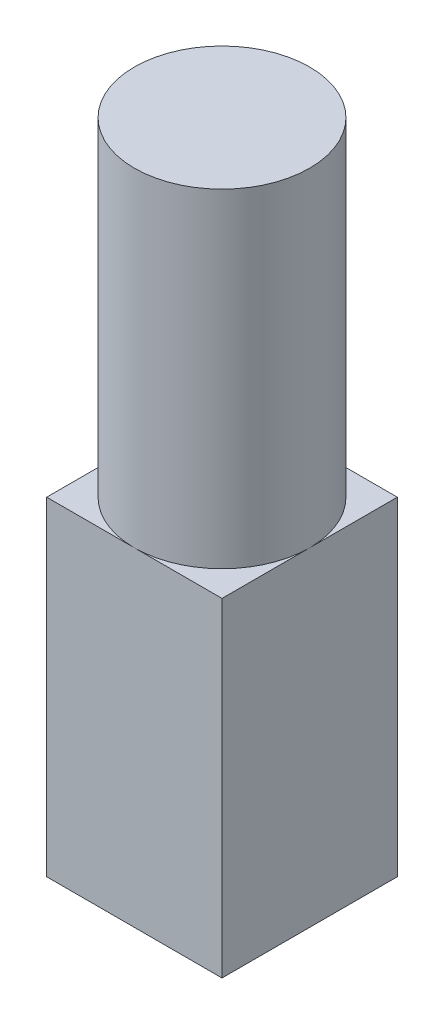
ISO-10303-21;
HEADER;
FILE_DESCRIPTION(('STEP AP214'),'2;1');
FILE_NAME('part.step','',(''),(''),'','','');
FILE_SCHEMA(('AUTOMOTIVE_DESIGN { 1 0 10303 214 1 1 1 1 }'));
ENDSEC;
DATA;
#1=APPLICATION_CONTEXT('core data for automotive mechanical design processes');
#2=APPLICATION_PROTOCOL_DEFINITION('international standard','automotive_design',2000,#1);
#3=PRODUCT_CONTEXT('',#1,'mechanical');
#4=PRODUCT('Part','Part','',(#3));
#5=PRODUCT_RELATED_PRODUCT_CATEGORY('part','',(#4));
#6=PRODUCT_DEFINITION_FORMATION('','',#4);
#7=PRODUCT_DEFINITION_CONTEXT('part definition',#1,'design');
#8=PRODUCT_DEFINITION('design','',#6,#7);
#9=PRODUCT_DEFINITION_SHAPE('','',#8);
#10=(LENGTH_UNIT() NAMED_UNIT(*) SI_UNIT(.MILLI.,.METRE.));
#11=(NAMED_UNIT(*) PLANE_ANGLE_UNIT() SI_UNIT($,.RADIAN.));
#12=(NAMED_UNIT(*) SI_UNIT($,.STERADIAN.) SOLID_ANGLE_UNIT());
#13=UNCERTAINTY_MEASURE_WITH_UNIT(LENGTH_MEASURE(1.E-05),#10,'distance_accuracy_value','');
#14=(GEOMETRIC_REPRESENTATION_CONTEXT(3) GLOBAL_UNCERTAINTY_ASSIGNED_CONTEXT((#13)) GLOBAL_UNIT_ASSIGNED_CONTEXT((#10,
#11,#12)) REPRESENTATION_CONTEXT('',''));
#15=CARTESIAN_POINT('',(0.,0.,0.));
#16=DIRECTION('',(0.,0.,1.));
#17=DIRECTION('',(1.,0.,0.));
#18=AXIS2_PLACEMENT_3D('',#15,#16,#17);
#19=CARTESIAN_POINT('',(0.,3.,0.));
#20=DIRECTION('',(0.,1.,0.));
#21=DIRECTION('',(0.,0.,1.));
#22=AXIS2_PLACEMENT_3D('',#19,#20,#21);
#23=PLANE('',#22);
#24=CARTESIAN_POINT('',(-86.8409372332624,3.,12.4374332279407));
#25=DIRECTION('',(0.,1.,0.));
#26=DIRECTION('',(0.,0.,1.));
#27=AXIS2_PLACEMENT_3D('',#24,#25,#26);
#28=CIRCLE('',#27,0.80000000000001);
#29=CARTESIAN_POINT('',(-86.8409372332624,3.,13.2374332279407));
#30=VERTEX_POINT('',#29);
#31=CARTESIAN_POINT('',(-86.0409372332624,3.,12.4374332279407));
#32=VERTEX_POINT('',#31);
#33=EDGE_CURVE('E57',#30,#32,#28,.T.);
#34=ORIENTED_EDGE('',*,*,#33,.F.);
#35=DIRECTION('',(1.,0.,0.));
#36=VECTOR('',#35,1.);
#37=CARTESIAN_POINT('',(-87.6409372332624,3.,13.2374332279407));
#38=LINE('',#37,#36);
#39=CARTESIAN_POINT('',(-86.0409372332624,3.,13.2374332279407));
#40=VERTEX_POINT('',#39);
#41=EDGE_CURVE('E112',#30,#40,#38,.T.);
#42=ORIENTED_EDGE('',*,*,#41,.T.);
#43=DIRECTION('',(0.,0.,-1.));
#44=VECTOR('',#43,1.);
#45=CARTESIAN_POINT('',(-86.0409372332624,3.,11.6374332279407));
#46=LINE('',#45,#44);
#47=EDGE_CURVE('E125',#40,#32,#46,.T.);
#48=ORIENTED_EDGE('',*,*,#47,.T.);
#49=EDGE_LOOP('',(#34,#42,#48));
#50=FACE_BOUND('',#49,.T.);
#51=ADVANCED_FACE('F45',(#50),#23,.T.);
#52=CARTESIAN_POINT('',(-86.8409372332624,3.,11.6374332279407));
#53=VERTEX_POINT('',#52);
#54=EDGE_CURVE('E11',#32,#53,#28,.T.);
#55=ORIENTED_EDGE('',*,*,#54,.F.);
#56=CARTESIAN_POINT('',(-86.0409372332624,3.,11.6374332279407));
#57=VERTEX_POINT('',#56);
#58=EDGE_CURVE('E111',#32,#57,#46,.T.);
#59=ORIENTED_EDGE('',*,*,#58,.T.);
#60=DIRECTION('',(-1.,0.,0.));
#61=VECTOR('',#60,1.);
#62=CARTESIAN_POINT('',(-87.6409372332624,3.,11.6374332279407));
#63=LINE('',#62,#61);
#64=EDGE_CURVE('E140',#57,#53,#63,.T.);
#65=ORIENTED_EDGE('',*,*,#64,.T.);
#66=EDGE_LOOP('',(#55,#59,#65));
#67=FACE_BOUND('',#66,.T.);
#68=ADVANCED_FACE('F199',(#67),#23,.T.);
#69=CARTESIAN_POINT('',(-87.6409372332624,3.,12.4374332279407));
#70=VERTEX_POINT('',#69);
#71=EDGE_CURVE('E55',#53,#70,#28,.T.);
#72=ORIENTED_EDGE('',*,*,#71,.F.);
#73=CARTESIAN_POINT('',(-87.6409372332624,3.,11.6374332279407));
#74=VERTEX_POINT('',#73);
#75=EDGE_CURVE('E139',#53,#74,#63,.T.);
#76=ORIENTED_EDGE('',*,*,#75,.T.);
#77=DIRECTION('',(0.,0.,1.));
#78=VECTOR('',#77,1.);
#79=CARTESIAN_POINT('',(-87.6409372332624,3.,11.6374332279407));
#80=LINE('',#79,#78);
#81=EDGE_CURVE('E123',#74,#70,#80,.T.);
#82=ORIENTED_EDGE('',*,*,#81,.T.);
#83=EDGE_LOOP('',(#72,#76,#82));
#84=FACE_BOUND('',#83,.T.);
#85=ADVANCED_FACE('F178',(#84),#23,.T.);
#86=CARTESIAN_POINT('',(-87.6409372332624,3.,11.6374332279407));
#87=DIRECTION('',(1.,0.,0.));
#88=DIRECTION('',(0.,0.,-1.));
#89=AXIS2_PLACEMENT_3D('',#86,#87,#88);
#90=PLANE('',#89);
#91=DIRECTION('',(0.,0.,1.));
#92=VECTOR('',#91,1.);
#93=CARTESIAN_POINT('',(-87.6409372332624,0.,11.6374332279407));
#94=LINE('',#93,#92);
#95=CARTESIAN_POINT('',(-87.6409372332624,0.,11.6374332279407));
#96=VERTEX_POINT('',#95);
#97=CARTESIAN_POINT('',(-87.6409372332624,0.,13.2374332279407));
#98=VERTEX_POINT('',#97);
#99=EDGE_CURVE('E144',#96,#98,#94,.T.);
#100=ORIENTED_EDGE('',*,*,#99,.T.);
#101=DIRECTION('',(0.,-1.,0.));
#102=VECTOR('',#101,1.);
#103=CARTESIAN_POINT('',(-87.6409372332624,3.,13.2374332279407));
#104=LINE('',#103,#102);
#105=CARTESIAN_POINT('',(-87.6409372332624,3.,13.2374332279407));
#106=VERTEX_POINT('',#105);
#107=EDGE_CURVE('E49',#106,#98,#104,.T.);
#108=ORIENTED_EDGE('',*,*,#107,.F.);
#109=EDGE_CURVE('E106',#70,#106,#80,.T.);
#110=ORIENTED_EDGE('',*,*,#109,.F.);
#111=ORIENTED_EDGE('',*,*,#81,.F.);
#112=DIRECTION('',(0.,-1.,0.));
#113=VECTOR('',#112,1.);
#114=CARTESIAN_POINT('',(-87.6409372332624,3.,11.6374332279407));
#115=LINE('',#114,#113);
#116=EDGE_CURVE('E143',#74,#96,#115,.T.);
#117=ORIENTED_EDGE('',*,*,#116,.T.);
#118=EDGE_LOOP('',(#100,#108,#110,#111,#117));
#119=FACE_BOUND('',#118,.T.);
#120=ADVANCED_FACE('F47',(#119),#90,.F.);
#121=CARTESIAN_POINT('',(-87.6409372332624,3.,13.2374332279407));
#122=DIRECTION('',(0.,0.,-1.));
#123=DIRECTION('',(-1.,0.,0.));
#124=AXIS2_PLACEMENT_3D('',#121,#122,#123);
#125=PLANE('',#124);
#126=DIRECTION('',(1.,0.,0.));
#127=VECTOR('',#126,1.);
#128=CARTESIAN_POINT('',(-87.6409372332624,0.,13.2374332279407));
#129=LINE('',#128,#127);
#130=CARTESIAN_POINT('',(-86.0409372332624,0.,13.2374332279407));
#131=VERTEX_POINT('',#130);
#132=EDGE_CURVE('E148',#98,#131,#129,.T.);
#133=ORIENTED_EDGE('',*,*,#132,.T.);
#134=DIRECTION('',(0.,-1.,0.));
#135=VECTOR('',#134,1.);
#136=CARTESIAN_POINT('',(-86.0409372332624,3.,13.2374332279407));
#137=LINE('',#136,#135);
#138=EDGE_CURVE('E118',#40,#131,#137,.T.);
#139=ORIENTED_EDGE('',*,*,#138,.F.);
#140=ORIENTED_EDGE('',*,*,#41,.F.);
#141=EDGE_CURVE('E100',#106,#30,#38,.T.);
#142=ORIENTED_EDGE('',*,*,#141,.F.);
#143=ORIENTED_EDGE('',*,*,#107,.T.);
#144=EDGE_LOOP('',(#133,#139,#140,#142,#143));
#145=FACE_BOUND('',#144,.T.);
#146=ADVANCED_FACE('F116',(#145),#125,.F.);
#147=CARTESIAN_POINT('',(-86.0409372332624,3.,11.6374332279407));
#148=DIRECTION('',(-1.,0.,0.));
#149=DIRECTION('',(0.,0.,1.));
#150=AXIS2_PLACEMENT_3D('',#147,#148,#149);
#151=PLANE('',#150);
#152=DIRECTION('',(0.,0.,-1.));
#153=VECTOR('',#152,1.);
#154=CARTESIAN_POINT('',(-86.0409372332624,0.,11.6374332279407));
#155=LINE('',#154,#153);
#156=CARTESIAN_POINT('',(-86.0409372332624,0.,11.6374332279407));
#157=VERTEX_POINT('',#156);
#158=EDGE_CURVE('E151',#131,#157,#155,.T.);
#159=ORIENTED_EDGE('',*,*,#158,.T.);
#160=DIRECTION('',(0.,-1.,0.));
#161=VECTOR('',#160,1.);
#162=CARTESIAN_POINT('',(-86.0409372332624,3.,11.6374332279407));
#163=LINE('',#162,#161);
#164=EDGE_CURVE('E160',#57,#157,#163,.T.);
#165=ORIENTED_EDGE('',*,*,#164,.F.);
#166=ORIENTED_EDGE('',*,*,#58,.F.);
#167=ORIENTED_EDGE('',*,*,#47,.F.);
#168=ORIENTED_EDGE('',*,*,#138,.T.);
#169=EDGE_LOOP('',(#159,#165,#166,#167,#168));
#170=FACE_BOUND('',#169,.T.);
#171=ADVANCED_FACE('F166',(#170),#151,.F.);
#172=CARTESIAN_POINT('',(-87.6409372332624,3.,11.6374332279407));
#173=DIRECTION('',(0.,0.,1.));
#174=DIRECTION('',(1.,0.,0.));
#175=AXIS2_PLACEMENT_3D('',#172,#173,#174);
#176=PLANE('',#175);
#177=DIRECTION('',(-1.,0.,0.));
#178=VECTOR('',#177,1.);
#179=CARTESIAN_POINT('',(-87.6409372332624,0.,11.6374332279407));
#180=LINE('',#179,#178);
#181=EDGE_CURVE('E154',#157,#96,#180,.T.);
#182=ORIENTED_EDGE('',*,*,#181,.T.);
#183=ORIENTED_EDGE('',*,*,#116,.F.);
#184=ORIENTED_EDGE('',*,*,#75,.F.);
#185=ORIENTED_EDGE('',*,*,#64,.F.);
#186=ORIENTED_EDGE('',*,*,#164,.T.);
#187=EDGE_LOOP('',(#182,#183,#184,#185,#186));
#188=FACE_BOUND('',#187,.T.);
#189=ADVANCED_FACE('F174',(#188),#176,.F.);
#190=EDGE_CURVE('E104',#70,#30,#28,.T.);
#191=ORIENTED_EDGE('',*,*,#190,.F.);
#192=ORIENTED_EDGE('',*,*,#109,.T.);
#193=ORIENTED_EDGE('',*,*,#141,.T.);
#194=EDGE_LOOP('',(#191,#192,#193));
#195=FACE_BOUND('',#194,.T.);
#196=ADVANCED_FACE('F102',(#195),#23,.T.);
#197=CARTESIAN_POINT('',(0.,0.,0.));
#198=DIRECTION('',(0.,1.,0.));
#199=DIRECTION('',(0.,0.,1.));
#200=AXIS2_PLACEMENT_3D('',#197,#198,#199);
#201=PLANE('',#200);
#202=ORIENTED_EDGE('',*,*,#99,.F.);
#203=ORIENTED_EDGE('',*,*,#181,.F.);
#204=ORIENTED_EDGE('',*,*,#158,.F.);
#205=ORIENTED_EDGE('',*,*,#132,.F.);
#206=EDGE_LOOP('',(#202,#203,#204,#205));
#207=FACE_BOUND('',#206,.T.);
#208=ADVANCED_FACE('F171',(#207),#201,.F.);
#209=CARTESIAN_POINT('',(-86.8409372332624,6.,12.4374332279407));
#210=DIRECTION('',(0.,-1.,0.));
#211=DIRECTION('',(0.,0.,-1.));
#212=AXIS2_PLACEMENT_3D('',#209,#210,#211);
#213=CYLINDRICAL_SURFACE('',#212,0.80000000000001);
#214=CARTESIAN_POINT('',(-86.8409372332624,6.,12.4374332279407));
#215=DIRECTION('',(0.,1.,0.));
#216=DIRECTION('',(0.,0.,1.));
#217=AXIS2_PLACEMENT_3D('',#214,#215,#216);
#218=CIRCLE('',#217,0.80000000000001);
#219=CARTESIAN_POINT('',(-86.8409372332624,6.,13.2374332279407));
#220=VERTEX_POINT('',#219);
#221=EDGE_CURVE('E128',#220,#220,#218,.T.);
#222=ORIENTED_EDGE('',*,*,#221,.F.);
#223=EDGE_LOOP('',(#222));
#224=FACE_BOUND('',#223,.T.);
#225=ORIENTED_EDGE('',*,*,#33,.T.);
#226=ORIENTED_EDGE('',*,*,#54,.T.);
#227=ORIENTED_EDGE('',*,*,#71,.T.);
#228=ORIENTED_EDGE('',*,*,#190,.T.);
#229=EDGE_LOOP('',(#225,#226,#227,#228));
#230=FACE_BOUND('',#229,.T.);
#231=ADVANCED_FACE('F129',(#224,#230),#213,.T.);
#232=CARTESIAN_POINT('',(-86.8409372332624,6.,12.4374332279407));
#233=DIRECTION('',(0.,1.,0.));
#234=DIRECTION('',(0.,0.,1.));
#235=AXIS2_PLACEMENT_3D('',#232,#233,#234);
#236=PLANE('',#235);
#237=ORIENTED_EDGE('',*,*,#221,.T.);
#238=EDGE_LOOP('',(#237));
#239=FACE_BOUND('',#238,.T.);
#240=ADVANCED_FACE('F186',(#239),#236,.T.);
#241=CLOSED_SHELL('',(#51,#68,#85,#120,#146,#171,#189,#196,#208,#231,#240));
#242=MANIFOLD_SOLID_BREP('B2',#241);
#243=ADVANCED_BREP_SHAPE_REPRESENTATION('',(#18,#242),#14);
#244=SHAPE_DEFINITION_REPRESENTATION(#9,#243);
ENDSEC;
END-ISO-10303-21;
